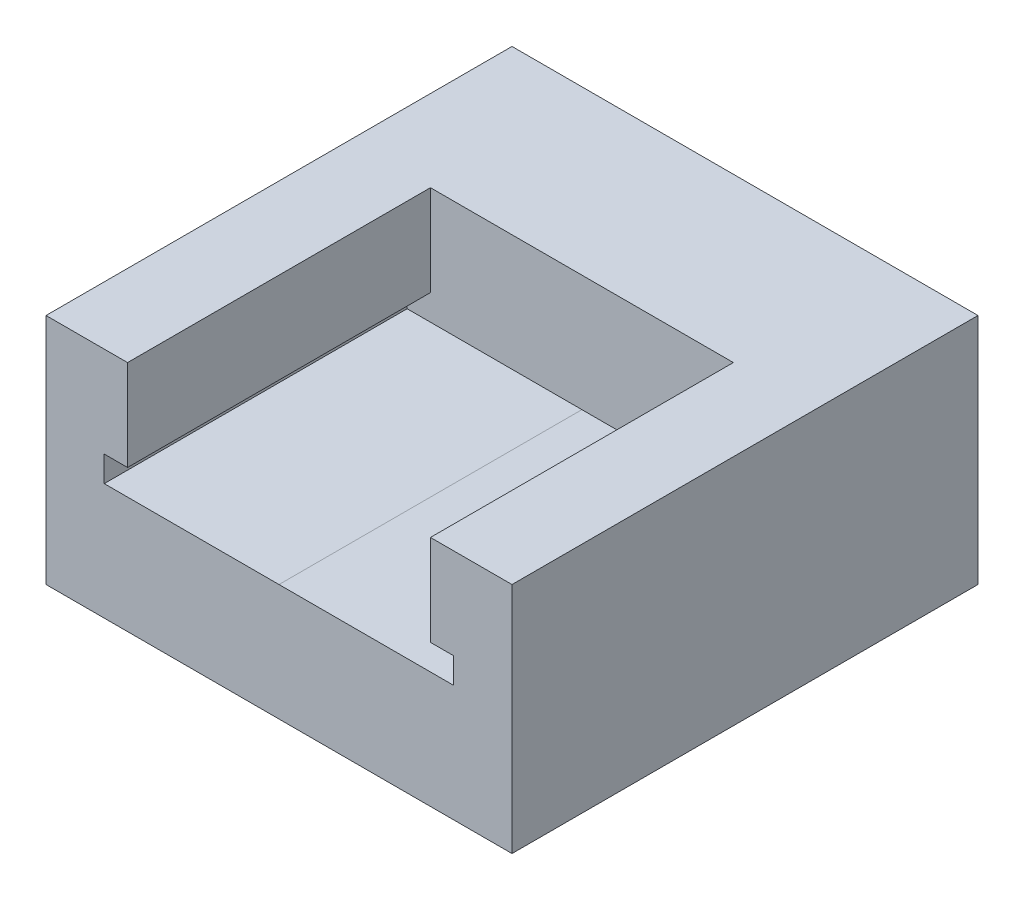
ISO-10303-21;
HEADER;
FILE_DESCRIPTION(('STEP AP214'),'2;1');
FILE_NAME('part.step','',(''),(''),'','','');
FILE_SCHEMA(('AUTOMOTIVE_DESIGN { 1 0 10303 214 1 1 1 1 }'));
ENDSEC;
DATA;
#1=APPLICATION_CONTEXT('core data for automotive mechanical design processes');
#2=APPLICATION_PROTOCOL_DEFINITION('international standard','automotive_design',2000,#1);
#3=PRODUCT_CONTEXT('',#1,'mechanical');
#4=PRODUCT('Part','Part','',(#3));
#5=PRODUCT_RELATED_PRODUCT_CATEGORY('part','',(#4));
#6=PRODUCT_DEFINITION_FORMATION('','',#4);
#7=PRODUCT_DEFINITION_CONTEXT('part definition',#1,'design');
#8=PRODUCT_DEFINITION('design','',#6,#7);
#9=PRODUCT_DEFINITION_SHAPE('','',#8);
#10=(LENGTH_UNIT() NAMED_UNIT(*) SI_UNIT(.MILLI.,.METRE.));
#11=(NAMED_UNIT(*) PLANE_ANGLE_UNIT() SI_UNIT($,.RADIAN.));
#12=(NAMED_UNIT(*) SI_UNIT($,.STERADIAN.) SOLID_ANGLE_UNIT());
#13=UNCERTAINTY_MEASURE_WITH_UNIT(LENGTH_MEASURE(1.E-05),#10,'distance_accuracy_value','');
#14=(GEOMETRIC_REPRESENTATION_CONTEXT(3) GLOBAL_UNCERTAINTY_ASSIGNED_CONTEXT((#13)) GLOBAL_UNIT_ASSIGNED_CONTEXT((#10,
#11,#12)) REPRESENTATION_CONTEXT('',''));
#15=CARTESIAN_POINT('',(0.,0.,0.));
#16=DIRECTION('',(0.,0.,1.));
#17=DIRECTION('',(1.,0.,0.));
#18=AXIS2_PLACEMENT_3D('',#15,#16,#17);
#19=CARTESIAN_POINT('',(-10.,5.,20.));
#20=DIRECTION('',(0.,-1.,0.));
#21=DIRECTION('',(0.,0.,-1.));
#22=AXIS2_PLACEMENT_3D('',#19,#20,#21);
#23=PLANE('',#22);
#24=DIRECTION('',(0.,0.,-1.));
#25=VECTOR('',#24,1.);
#26=CARTESIAN_POINT('',(6.5,5.,82.5));
#27=LINE('',#26,#25);
#28=CARTESIAN_POINT('',(6.5,5.,20.));
#29=VERTEX_POINT('',#28);
#30=CARTESIAN_POINT('',(6.5,5.,7.));
#31=VERTEX_POINT('',#30);
#32=EDGE_CURVE('E182',#29,#31,#27,.T.);
#33=ORIENTED_EDGE('',*,*,#32,.F.);
#34=DIRECTION('',(-1.,0.,0.));
#35=VECTOR('',#34,1.);
#36=CARTESIAN_POINT('',(-10.,5.,20.));
#37=LINE('',#36,#35);
#38=CARTESIAN_POINT('',(10.,5.,20.));
#39=VERTEX_POINT('',#38);
#40=EDGE_CURVE('E200',#39,#29,#37,.T.);
#41=ORIENTED_EDGE('',*,*,#40,.F.);
#42=DIRECTION('',(0.,0.,-1.));
#43=VECTOR('',#42,1.);
#44=CARTESIAN_POINT('',(10.,5.,20.));
#45=LINE('',#44,#43);
#46=CARTESIAN_POINT('',(10.,5.,0.));
#47=VERTEX_POINT('',#46);
#48=EDGE_CURVE('E11',#39,#47,#45,.T.);
#49=ORIENTED_EDGE('',*,*,#48,.T.);
#50=DIRECTION('',(-1.,0.,0.));
#51=VECTOR('',#50,1.);
#52=CARTESIAN_POINT('',(-10.,5.,0.));
#53=LINE('',#52,#51);
#54=CARTESIAN_POINT('',(-10.,5.,0.));
#55=VERTEX_POINT('',#54);
#56=EDGE_CURVE('E213',#47,#55,#53,.T.);
#57=ORIENTED_EDGE('',*,*,#56,.T.);
#58=DIRECTION('',(0.,0.,-1.));
#59=VECTOR('',#58,1.);
#60=CARTESIAN_POINT('',(-10.,5.,20.));
#61=LINE('',#60,#59);
#62=CARTESIAN_POINT('',(-10.,5.,20.));
#63=VERTEX_POINT('',#62);
#64=EDGE_CURVE('E48',#63,#55,#61,.T.);
#65=ORIENTED_EDGE('',*,*,#64,.F.);
#66=CARTESIAN_POINT('',(-6.5,5.,20.));
#67=VERTEX_POINT('',#66);
#68=EDGE_CURVE('E198',#67,#63,#37,.T.);
#69=ORIENTED_EDGE('',*,*,#68,.F.);
#70=DIRECTION('',(0.,0.,-1.));
#71=VECTOR('',#70,1.);
#72=CARTESIAN_POINT('',(-6.5,5.,82.5));
#73=LINE('',#72,#71);
#74=CARTESIAN_POINT('',(-6.5,5.,7.));
#75=VERTEX_POINT('',#74);
#76=EDGE_CURVE('E60',#67,#75,#73,.T.);
#77=ORIENTED_EDGE('',*,*,#76,.T.);
#78=DIRECTION('',(-1.,0.,0.));
#79=VECTOR('',#78,1.);
#80=CARTESIAN_POINT('',(-10.,5.,7.));
#81=LINE('',#80,#79);
#82=EDGE_CURVE('E55',#31,#75,#81,.T.);
#83=ORIENTED_EDGE('',*,*,#82,.F.);
#84=EDGE_LOOP('',(#33,#41,#49,#57,#65,#69,#77,#83));
#85=FACE_BOUND('',#84,.T.);
#86=ADVANCED_FACE('F39',(#85),#23,.F.);
#87=CARTESIAN_POINT('',(10.,-5.,20.));
#88=DIRECTION('',(-1.,0.,0.));
#89=DIRECTION('',(0.,0.,1.));
#90=AXIS2_PLACEMENT_3D('',#87,#88,#89);
#91=PLANE('',#90);
#92=DIRECTION('',(0.,1.,0.));
#93=VECTOR('',#92,1.);
#94=CARTESIAN_POINT('',(10.,-5.,0.));
#95=LINE('',#94,#93);
#96=CARTESIAN_POINT('',(10.,-5.,0.));
#97=VERTEX_POINT('',#96);
#98=EDGE_CURVE('E190',#97,#47,#95,.T.);
#99=ORIENTED_EDGE('',*,*,#98,.T.);
#100=ORIENTED_EDGE('',*,*,#48,.F.);
#101=DIRECTION('',(0.,1.,0.));
#102=VECTOR('',#101,1.);
#103=CARTESIAN_POINT('',(10.,-5.,20.));
#104=LINE('',#103,#102);
#105=CARTESIAN_POINT('',(10.,-5.,20.));
#106=VERTEX_POINT('',#105);
#107=EDGE_CURVE('E194',#106,#39,#104,.T.);
#108=ORIENTED_EDGE('',*,*,#107,.F.);
#109=DIRECTION('',(0.,0.,-1.));
#110=VECTOR('',#109,1.);
#111=CARTESIAN_POINT('',(10.,-5.,20.));
#112=LINE('',#111,#110);
#113=EDGE_CURVE('E209',#106,#97,#112,.T.);
#114=ORIENTED_EDGE('',*,*,#113,.T.);
#115=EDGE_LOOP('',(#99,#100,#108,#114));
#116=FACE_BOUND('',#115,.T.);
#117=ADVANCED_FACE('F41',(#116),#91,.F.);
#118=CARTESIAN_POINT('',(-10.,-5.,20.));
#119=DIRECTION('',(1.,0.,0.));
#120=DIRECTION('',(0.,0.,-1.));
#121=AXIS2_PLACEMENT_3D('',#118,#119,#120);
#122=PLANE('',#121);
#123=DIRECTION('',(0.,-1.,0.));
#124=VECTOR('',#123,1.);
#125=CARTESIAN_POINT('',(-10.,-5.,0.));
#126=LINE('',#125,#124);
#127=CARTESIAN_POINT('',(-10.,-5.,0.));
#128=VERTEX_POINT('',#127);
#129=EDGE_CURVE('E216',#55,#128,#126,.T.);
#130=ORIENTED_EDGE('',*,*,#129,.T.);
#131=DIRECTION('',(0.,0.,-1.));
#132=VECTOR('',#131,1.);
#133=CARTESIAN_POINT('',(-10.,-5.,20.));
#134=LINE('',#133,#132);
#135=CARTESIAN_POINT('',(-10.,-5.,20.));
#136=VERTEX_POINT('',#135);
#137=EDGE_CURVE('E224',#136,#128,#134,.T.);
#138=ORIENTED_EDGE('',*,*,#137,.F.);
#139=DIRECTION('',(0.,-1.,0.));
#140=VECTOR('',#139,1.);
#141=CARTESIAN_POINT('',(-10.,-5.,20.));
#142=LINE('',#141,#140);
#143=EDGE_CURVE('E203',#63,#136,#142,.T.);
#144=ORIENTED_EDGE('',*,*,#143,.F.);
#145=ORIENTED_EDGE('',*,*,#64,.T.);
#146=EDGE_LOOP('',(#130,#138,#144,#145));
#147=FACE_BOUND('',#146,.T.);
#148=ADVANCED_FACE('F233',(#147),#122,.F.);
#149=CARTESIAN_POINT('',(-10.,-5.,20.));
#150=DIRECTION('',(0.,1.,0.));
#151=DIRECTION('',(0.,0.,1.));
#152=AXIS2_PLACEMENT_3D('',#149,#150,#151);
#153=PLANE('',#152);
#154=DIRECTION('',(1.,0.,0.));
#155=VECTOR('',#154,1.);
#156=CARTESIAN_POINT('',(-10.,-5.,0.));
#157=LINE('',#156,#155);
#158=EDGE_CURVE('E199',#128,#97,#157,.T.);
#159=ORIENTED_EDGE('',*,*,#158,.T.);
#160=ORIENTED_EDGE('',*,*,#113,.F.);
#161=DIRECTION('',(1.,0.,0.));
#162=VECTOR('',#161,1.);
#163=CARTESIAN_POINT('',(-10.,-5.,20.));
#164=LINE('',#163,#162);
#165=EDGE_CURVE('E206',#136,#106,#164,.T.);
#166=ORIENTED_EDGE('',*,*,#165,.F.);
#167=ORIENTED_EDGE('',*,*,#137,.T.);
#168=EDGE_LOOP('',(#159,#160,#166,#167));
#169=FACE_BOUND('',#168,.T.);
#170=ADVANCED_FACE('F241',(#169),#153,.F.);
#171=CARTESIAN_POINT('',(0.,0.,20.));
#172=DIRECTION('',(0.,0.,-1.));
#173=DIRECTION('',(-1.,0.,0.));
#174=AXIS2_PLACEMENT_3D('',#171,#172,#173);
#175=PLANE('',#174);
#176=ORIENTED_EDGE('',*,*,#40,.T.);
#177=DIRECTION('',(0.,-1.,0.));
#178=VECTOR('',#177,1.);
#179=CARTESIAN_POINT('',(6.5,1.1,20.));
#180=LINE('',#179,#178);
#181=CARTESIAN_POINT('',(6.5,1.1,20.));
#182=VERTEX_POINT('',#181);
#183=EDGE_CURVE('E193',#29,#182,#180,.T.);
#184=ORIENTED_EDGE('',*,*,#183,.T.);
#185=DIRECTION('',(1.,0.,0.));
#186=VECTOR('',#185,1.);
#187=CARTESIAN_POINT('',(7.5,1.1,20.));
#188=LINE('',#187,#186);
#189=CARTESIAN_POINT('',(7.5,1.1,20.));
#190=VERTEX_POINT('',#189);
#191=EDGE_CURVE('E269',#182,#190,#188,.T.);
#192=ORIENTED_EDGE('',*,*,#191,.T.);
#193=DIRECTION('',(0.,-1.,0.));
#194=VECTOR('',#193,1.);
#195=CARTESIAN_POINT('',(7.5,0.,20.));
#196=LINE('',#195,#194);
#197=CARTESIAN_POINT('',(7.5,0.,20.));
#198=VERTEX_POINT('',#197);
#199=EDGE_CURVE('E266',#190,#198,#196,.T.);
#200=ORIENTED_EDGE('',*,*,#199,.T.);
#201=DIRECTION('',(-1.,0.,0.));
#202=VECTOR('',#201,1.);
#203=CARTESIAN_POINT('',(0.,0.,20.));
#204=LINE('',#203,#202);
#205=CARTESIAN_POINT('',(0.,0.,20.));
#206=VERTEX_POINT('',#205);
#207=EDGE_CURVE('E263',#198,#206,#204,.T.);
#208=ORIENTED_EDGE('',*,*,#207,.T.);
#209=DIRECTION('',(-1.,0.,0.));
#210=VECTOR('',#209,1.);
#211=CARTESIAN_POINT('',(-7.5,0.,20.));
#212=LINE('',#211,#210);
#213=CARTESIAN_POINT('',(-7.5,0.,20.));
#214=VERTEX_POINT('',#213);
#215=EDGE_CURVE('E140',#206,#214,#212,.T.);
#216=ORIENTED_EDGE('',*,*,#215,.T.);
#217=DIRECTION('',(0.,1.,0.));
#218=VECTOR('',#217,1.);
#219=CARTESIAN_POINT('',(-7.5,1.1,20.));
#220=LINE('',#219,#218);
#221=CARTESIAN_POINT('',(-7.5,1.1,20.));
#222=VERTEX_POINT('',#221);
#223=EDGE_CURVE('E133',#214,#222,#220,.T.);
#224=ORIENTED_EDGE('',*,*,#223,.T.);
#225=DIRECTION('',(1.,0.,0.));
#226=VECTOR('',#225,1.);
#227=CARTESIAN_POINT('',(-6.5,1.1,20.));
#228=LINE('',#227,#226);
#229=CARTESIAN_POINT('',(-6.5,1.1,20.));
#230=VERTEX_POINT('',#229);
#231=EDGE_CURVE('E137',#222,#230,#228,.T.);
#232=ORIENTED_EDGE('',*,*,#231,.T.);
#233=DIRECTION('',(0.,1.,0.));
#234=VECTOR('',#233,1.);
#235=CARTESIAN_POINT('',(-6.5,5.,20.));
#236=LINE('',#235,#234);
#237=EDGE_CURVE('E156',#230,#67,#236,.T.);
#238=ORIENTED_EDGE('',*,*,#237,.T.);
#239=ORIENTED_EDGE('',*,*,#68,.T.);
#240=ORIENTED_EDGE('',*,*,#143,.T.);
#241=ORIENTED_EDGE('',*,*,#165,.T.);
#242=ORIENTED_EDGE('',*,*,#107,.T.);
#243=EDGE_LOOP('',(#176,#184,#192,#200,#208,#216,#224,#232,#238,#239,#240,#241,#242));
#244=FACE_BOUND('',#243,.T.);
#245=ADVANCED_FACE('F136',(#244),#175,.F.);
#246=CARTESIAN_POINT('',(0.,0.,0.));
#247=DIRECTION('',(0.,0.,-1.));
#248=DIRECTION('',(-1.,0.,0.));
#249=AXIS2_PLACEMENT_3D('',#246,#247,#248);
#250=PLANE('',#249);
#251=ORIENTED_EDGE('',*,*,#98,.F.);
#252=ORIENTED_EDGE('',*,*,#158,.F.);
#253=ORIENTED_EDGE('',*,*,#129,.F.);
#254=ORIENTED_EDGE('',*,*,#56,.F.);
#255=EDGE_LOOP('',(#251,#252,#253,#254));
#256=FACE_BOUND('',#255,.T.);
#257=ADVANCED_FACE('F238',(#256),#250,.T.);
#258=CARTESIAN_POINT('',(6.5,1.1,82.5));
#259=DIRECTION('',(-1.,0.,0.));
#260=DIRECTION('',(0.,0.,1.));
#261=AXIS2_PLACEMENT_3D('',#258,#259,#260);
#262=PLANE('',#261);
#263=ORIENTED_EDGE('',*,*,#183,.F.);
#264=ORIENTED_EDGE('',*,*,#32,.T.);
#265=DIRECTION('',(0.,-1.,0.));
#266=VECTOR('',#265,1.);
#267=CARTESIAN_POINT('',(6.5,1.1,7.00000000000001));
#268=LINE('',#267,#266);
#269=CARTESIAN_POINT('',(6.5,1.1,7.));
#270=VERTEX_POINT('',#269);
#271=EDGE_CURVE('E253',#31,#270,#268,.T.);
#272=ORIENTED_EDGE('',*,*,#271,.T.);
#273=DIRECTION('',(0.,0.,-1.));
#274=VECTOR('',#273,1.);
#275=CARTESIAN_POINT('',(6.5,1.1,82.5));
#276=LINE('',#275,#274);
#277=EDGE_CURVE('E186',#182,#270,#276,.T.);
#278=ORIENTED_EDGE('',*,*,#277,.F.);
#279=EDGE_LOOP('',(#263,#264,#272,#278));
#280=FACE_BOUND('',#279,.T.);
#281=ADVANCED_FACE('F299',(#280),#262,.T.);
#282=CARTESIAN_POINT('',(7.5,1.1,82.5));
#283=DIRECTION('',(0.,-1.,0.));
#284=DIRECTION('',(0.,0.,-1.));
#285=AXIS2_PLACEMENT_3D('',#282,#283,#284);
#286=PLANE('',#285);
#287=ORIENTED_EDGE('',*,*,#191,.F.);
#288=ORIENTED_EDGE('',*,*,#277,.T.);
#289=DIRECTION('',(1.,0.,0.));
#290=VECTOR('',#289,1.);
#291=CARTESIAN_POINT('',(7.5,1.1,7.00000000000001));
#292=LINE('',#291,#290);
#293=CARTESIAN_POINT('',(7.5,1.1,7.));
#294=VERTEX_POINT('',#293);
#295=EDGE_CURVE('E256',#270,#294,#292,.T.);
#296=ORIENTED_EDGE('',*,*,#295,.T.);
#297=DIRECTION('',(0.,0.,-1.));
#298=VECTOR('',#297,1.);
#299=CARTESIAN_POINT('',(7.5,1.1,82.5));
#300=LINE('',#299,#298);
#301=EDGE_CURVE('E178',#190,#294,#300,.T.);
#302=ORIENTED_EDGE('',*,*,#301,.F.);
#303=EDGE_LOOP('',(#287,#288,#296,#302));
#304=FACE_BOUND('',#303,.T.);
#305=ADVANCED_FACE('F304',(#304),#286,.T.);
#306=CARTESIAN_POINT('',(7.5,0.,82.5));
#307=DIRECTION('',(-1.,0.,0.));
#308=DIRECTION('',(0.,0.,1.));
#309=AXIS2_PLACEMENT_3D('',#306,#307,#308);
#310=PLANE('',#309);
#311=ORIENTED_EDGE('',*,*,#199,.F.);
#312=ORIENTED_EDGE('',*,*,#301,.T.);
#313=DIRECTION('',(0.,-1.,0.));
#314=VECTOR('',#313,1.);
#315=CARTESIAN_POINT('',(7.5,0.,7.00000000000001));
#316=LINE('',#315,#314);
#317=CARTESIAN_POINT('',(7.5,0.,7.));
#318=VERTEX_POINT('',#317);
#319=EDGE_CURVE('E277',#294,#318,#316,.T.);
#320=ORIENTED_EDGE('',*,*,#319,.T.);
#321=DIRECTION('',(0.,0.,-1.));
#322=VECTOR('',#321,1.);
#323=CARTESIAN_POINT('',(7.5,0.,82.5));
#324=LINE('',#323,#322);
#325=EDGE_CURVE('E174',#198,#318,#324,.T.);
#326=ORIENTED_EDGE('',*,*,#325,.F.);
#327=EDGE_LOOP('',(#311,#312,#320,#326));
#328=FACE_BOUND('',#327,.T.);
#329=ADVANCED_FACE('F306',(#328),#310,.T.);
#330=CARTESIAN_POINT('',(0.,0.,82.5));
#331=DIRECTION('',(0.,1.,0.));
#332=DIRECTION('',(0.,0.,1.));
#333=AXIS2_PLACEMENT_3D('',#330,#331,#332);
#334=PLANE('',#333);
#335=ORIENTED_EDGE('',*,*,#207,.F.);
#336=ORIENTED_EDGE('',*,*,#325,.T.);
#337=DIRECTION('',(-1.,0.,0.));
#338=VECTOR('',#337,1.);
#339=CARTESIAN_POINT('',(0.,0.,7.00000000000001));
#340=LINE('',#339,#338);
#341=CARTESIAN_POINT('',(0.,0.,7.));
#342=VERTEX_POINT('',#341);
#343=EDGE_CURVE('E281',#318,#342,#340,.T.);
#344=ORIENTED_EDGE('',*,*,#343,.T.);
#345=DIRECTION('',(0.,0.,-1.));
#346=VECTOR('',#345,1.);
#347=CARTESIAN_POINT('',(0.,0.,82.5));
#348=LINE('',#347,#346);
#349=EDGE_CURVE('E166',#206,#342,#348,.T.);
#350=ORIENTED_EDGE('',*,*,#349,.F.);
#351=EDGE_LOOP('',(#335,#336,#344,#350));
#352=FACE_BOUND('',#351,.T.);
#353=ADVANCED_FACE('F311',(#352),#334,.T.);
#354=CARTESIAN_POINT('',(-7.5,0.,82.5));
#355=DIRECTION('',(0.,1.,0.));
#356=DIRECTION('',(0.,0.,1.));
#357=AXIS2_PLACEMENT_3D('',#354,#355,#356);
#358=PLANE('',#357);
#359=ORIENTED_EDGE('',*,*,#215,.F.);
#360=ORIENTED_EDGE('',*,*,#349,.T.);
#361=DIRECTION('',(-1.,0.,0.));
#362=VECTOR('',#361,1.);
#363=CARTESIAN_POINT('',(-7.5,0.,7.00000000000001));
#364=LINE('',#363,#362);
#365=CARTESIAN_POINT('',(-7.5,0.,7.));
#366=VERTEX_POINT('',#365);
#367=EDGE_CURVE('E285',#342,#366,#364,.T.);
#368=ORIENTED_EDGE('',*,*,#367,.T.);
#369=DIRECTION('',(0.,0.,-1.));
#370=VECTOR('',#369,1.);
#371=CARTESIAN_POINT('',(-7.5,0.,82.5));
#372=LINE('',#371,#370);
#373=EDGE_CURVE('E162',#214,#366,#372,.T.);
#374=ORIENTED_EDGE('',*,*,#373,.F.);
#375=EDGE_LOOP('',(#359,#360,#368,#374));
#376=FACE_BOUND('',#375,.T.);
#377=ADVANCED_FACE('F313',(#376),#358,.T.);
#378=CARTESIAN_POINT('',(-7.5,1.1,82.5));
#379=DIRECTION('',(1.,0.,0.));
#380=DIRECTION('',(0.,0.,-1.));
#381=AXIS2_PLACEMENT_3D('',#378,#379,#380);
#382=PLANE('',#381);
#383=ORIENTED_EDGE('',*,*,#223,.F.);
#384=ORIENTED_EDGE('',*,*,#373,.T.);
#385=DIRECTION('',(0.,1.,0.));
#386=VECTOR('',#385,1.);
#387=CARTESIAN_POINT('',(-7.5,1.1,7.00000000000001));
#388=LINE('',#387,#386);
#389=CARTESIAN_POINT('',(-7.5,1.1,7.));
#390=VERTEX_POINT('',#389);
#391=EDGE_CURVE('E160',#366,#390,#388,.T.);
#392=ORIENTED_EDGE('',*,*,#391,.T.);
#393=DIRECTION('',(0.,0.,-1.));
#394=VECTOR('',#393,1.);
#395=CARTESIAN_POINT('',(-7.5,1.1,82.5));
#396=LINE('',#395,#394);
#397=EDGE_CURVE('E152',#222,#390,#396,.T.);
#398=ORIENTED_EDGE('',*,*,#397,.F.);
#399=EDGE_LOOP('',(#383,#384,#392,#398));
#400=FACE_BOUND('',#399,.T.);
#401=ADVANCED_FACE('F159',(#400),#382,.T.);
#402=CARTESIAN_POINT('',(-6.5,1.1,82.5));
#403=DIRECTION('',(0.,-1.,0.));
#404=DIRECTION('',(1.,0.,0.));
#405=AXIS2_PLACEMENT_3D('',#402,#403,#404);
#406=PLANE('',#405);
#407=ORIENTED_EDGE('',*,*,#231,.F.);
#408=ORIENTED_EDGE('',*,*,#397,.T.);
#409=DIRECTION('',(1.,0.,0.));
#410=VECTOR('',#409,1.);
#411=CARTESIAN_POINT('',(-6.5,1.1,7.00000000000001));
#412=LINE('',#411,#410);
#413=CARTESIAN_POINT('',(-6.5,1.1,7.));
#414=VERTEX_POINT('',#413);
#415=EDGE_CURVE('E291',#390,#414,#412,.T.);
#416=ORIENTED_EDGE('',*,*,#415,.T.);
#417=DIRECTION('',(0.,0.,-1.));
#418=VECTOR('',#417,1.);
#419=CARTESIAN_POINT('',(-6.5,1.1,82.5));
#420=LINE('',#419,#418);
#421=EDGE_CURVE('E154',#230,#414,#420,.T.);
#422=ORIENTED_EDGE('',*,*,#421,.F.);
#423=EDGE_LOOP('',(#407,#408,#416,#422));
#424=FACE_BOUND('',#423,.T.);
#425=ADVANCED_FACE('F150',(#424),#406,.T.);
#426=CARTESIAN_POINT('',(-6.5,5.,82.5));
#427=DIRECTION('',(1.,0.,0.));
#428=DIRECTION('',(0.,1.,0.));
#429=AXIS2_PLACEMENT_3D('',#426,#427,#428);
#430=PLANE('',#429);
#431=ORIENTED_EDGE('',*,*,#237,.F.);
#432=ORIENTED_EDGE('',*,*,#421,.T.);
#433=DIRECTION('',(0.,1.,0.));
#434=VECTOR('',#433,1.);
#435=CARTESIAN_POINT('',(-6.5,5.,7.00000000000001));
#436=LINE('',#435,#434);
#437=EDGE_CURVE('E251',#414,#75,#436,.T.);
#438=ORIENTED_EDGE('',*,*,#437,.T.);
#439=ORIENTED_EDGE('',*,*,#76,.F.);
#440=EDGE_LOOP('',(#431,#432,#438,#439));
#441=FACE_BOUND('',#440,.T.);
#442=ADVANCED_FACE('F250',(#441),#430,.T.);
#443=CARTESIAN_POINT('',(0.,0.,7.));
#444=DIRECTION('',(0.,0.,-1.));
#445=DIRECTION('',(-1.,0.,0.));
#446=AXIS2_PLACEMENT_3D('',#443,#444,#445);
#447=PLANE('',#446);
#448=ORIENTED_EDGE('',*,*,#82,.T.);
#449=ORIENTED_EDGE('',*,*,#437,.F.);
#450=ORIENTED_EDGE('',*,*,#415,.F.);
#451=ORIENTED_EDGE('',*,*,#391,.F.);
#452=ORIENTED_EDGE('',*,*,#367,.F.);
#453=ORIENTED_EDGE('',*,*,#343,.F.);
#454=ORIENTED_EDGE('',*,*,#319,.F.);
#455=ORIENTED_EDGE('',*,*,#295,.F.);
#456=ORIENTED_EDGE('',*,*,#271,.F.);
#457=EDGE_LOOP('',(#448,#449,#450,#451,#452,#453,#454,#455,#456));
#458=FACE_BOUND('',#457,.T.);
#459=ADVANCED_FACE('F296',(#458),#447,.F.);
#460=CLOSED_SHELL('',(#86,#117,#148,#170,#245,#257,#281,#305,#329,#353,#377,#401,#425,#442,#459));
#461=MANIFOLD_SOLID_BREP('B2',#460);
#462=ADVANCED_BREP_SHAPE_REPRESENTATION('',(#18,#461),#14);
#463=SHAPE_DEFINITION_REPRESENTATION(#9,#462);
ENDSEC;
END-ISO-10303-21;
